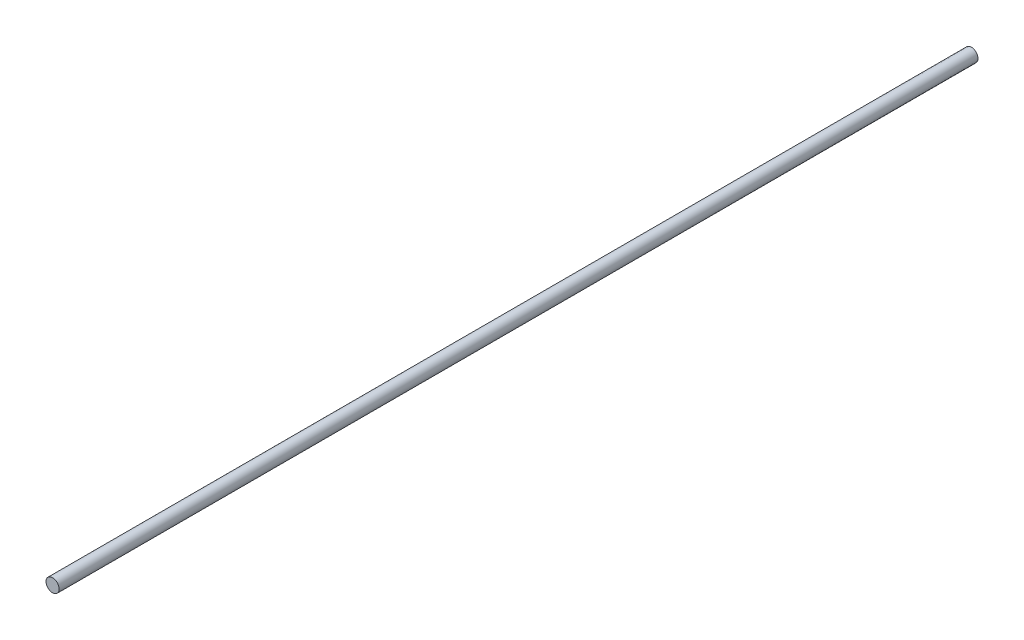
ISO-10303-21;
HEADER;
FILE_DESCRIPTION(('STEP AP214'),'2;1');
FILE_NAME('part.step','',(''),(''),'','','');
FILE_SCHEMA(('AUTOMOTIVE_DESIGN { 1 0 10303 214 1 1 1 1 }'));
ENDSEC;
DATA;
#1=APPLICATION_CONTEXT('core data for automotive mechanical design processes');
#2=APPLICATION_PROTOCOL_DEFINITION('international standard','automotive_design',2000,#1);
#3=PRODUCT_CONTEXT('',#1,'mechanical');
#4=PRODUCT('Part','Part','',(#3));
#5=PRODUCT_RELATED_PRODUCT_CATEGORY('part','',(#4));
#6=PRODUCT_DEFINITION_FORMATION('','',#4);
#7=PRODUCT_DEFINITION_CONTEXT('part definition',#1,'design');
#8=PRODUCT_DEFINITION('design','',#6,#7);
#9=PRODUCT_DEFINITION_SHAPE('','',#8);
#10=(LENGTH_UNIT() NAMED_UNIT(*) SI_UNIT(.MILLI.,.METRE.));
#11=(NAMED_UNIT(*) PLANE_ANGLE_UNIT() SI_UNIT($,.RADIAN.));
#12=(NAMED_UNIT(*) SI_UNIT($,.STERADIAN.) SOLID_ANGLE_UNIT());
#13=UNCERTAINTY_MEASURE_WITH_UNIT(LENGTH_MEASURE(1.E-05),#10,'distance_accuracy_value','');
#14=(GEOMETRIC_REPRESENTATION_CONTEXT(3) GLOBAL_UNCERTAINTY_ASSIGNED_CONTEXT((#13)) GLOBAL_UNIT_ASSIGNED_CONTEXT((#10,
#11,#12)) REPRESENTATION_CONTEXT('',''));
#15=CARTESIAN_POINT('',(0.,0.,0.));
#16=DIRECTION('',(0.,0.,1.));
#17=DIRECTION('',(1.,0.,0.));
#18=AXIS2_PLACEMENT_3D('',#15,#16,#17);
#19=CARTESIAN_POINT('',(0.,0.,175.));
#20=DIRECTION('',(0.,0.,-1.));
#21=DIRECTION('',(-1.,0.,0.));
#22=AXIS2_PLACEMENT_3D('',#19,#20,#21);
#23=CYLINDRICAL_SURFACE('',#22,2.5);
#24=CARTESIAN_POINT('',(0.,0.,175.));
#25=DIRECTION('',(0.,0.,1.));
#26=DIRECTION('',(1.,0.,0.));
#27=AXIS2_PLACEMENT_3D('',#24,#25,#26);
#28=CIRCLE('',#27,2.5);
#29=CARTESIAN_POINT('',(2.5,0.,175.));
#30=VERTEX_POINT('',#29);
#31=EDGE_CURVE('E10',#30,#30,#28,.T.);
#32=ORIENTED_EDGE('',*,*,#31,.F.);
#33=EDGE_LOOP('',(#32));
#34=FACE_BOUND('',#33,.T.);
#35=CARTESIAN_POINT('',(0.,0.,-175.));
#36=DIRECTION('',(0.,0.,1.));
#37=DIRECTION('',(1.,0.,0.));
#38=AXIS2_PLACEMENT_3D('',#35,#36,#37);
#39=CIRCLE('',#38,2.5);
#40=CARTESIAN_POINT('',(2.5,0.,-175.));
#41=VERTEX_POINT('',#40);
#42=EDGE_CURVE('E34',#41,#41,#39,.T.);
#43=ORIENTED_EDGE('',*,*,#42,.T.);
#44=EDGE_LOOP('',(#43));
#45=FACE_BOUND('',#44,.T.);
#46=ADVANCED_FACE('F31',(#34,#45),#23,.T.);
#47=CARTESIAN_POINT('',(0.,0.,175.));
#48=DIRECTION('',(0.,0.,1.));
#49=DIRECTION('',(1.,0.,0.));
#50=AXIS2_PLACEMENT_3D('',#47,#48,#49);
#51=PLANE('',#50);
#52=ORIENTED_EDGE('',*,*,#31,.T.);
#53=EDGE_LOOP('',(#52));
#54=FACE_BOUND('',#53,.T.);
#55=ADVANCED_FACE('F46',(#54),#51,.T.);
#56=CARTESIAN_POINT('',(0.,0.,-175.));
#57=DIRECTION('',(0.,0.,1.));
#58=DIRECTION('',(1.,0.,0.));
#59=AXIS2_PLACEMENT_3D('',#56,#57,#58);
#60=PLANE('',#59);
#61=ORIENTED_EDGE('',*,*,#42,.F.);
#62=EDGE_LOOP('',(#61));
#63=FACE_BOUND('',#62,.T.);
#64=ADVANCED_FACE('F44',(#63),#60,.F.);
#65=CLOSED_SHELL('',(#46,#55,#64));
#66=MANIFOLD_SOLID_BREP('B2',#65);
#67=ADVANCED_BREP_SHAPE_REPRESENTATION('',(#18,#66),#14);
#68=SHAPE_DEFINITION_REPRESENTATION(#9,#67);
ENDSEC;
END-ISO-10303-21;
